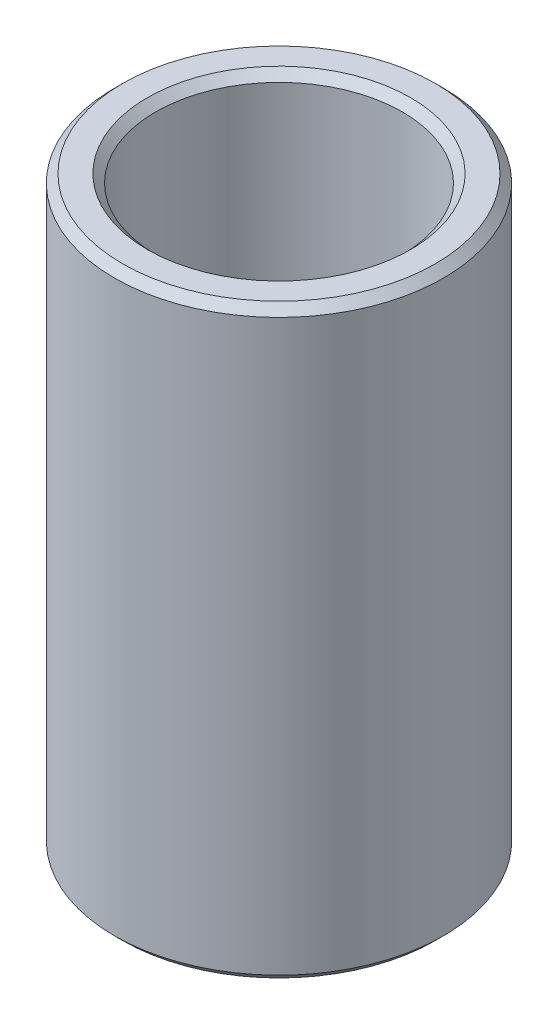
ISO-10303-21;
HEADER;
FILE_DESCRIPTION(('STEP AP214'),'2;1');
FILE_NAME('part.step','',(''),(''),'','','');
FILE_SCHEMA(('AUTOMOTIVE_DESIGN { 1 0 10303 214 1 1 1 1 }'));
ENDSEC;
DATA;
#1=APPLICATION_CONTEXT('core data for automotive mechanical design processes');
#2=APPLICATION_PROTOCOL_DEFINITION('international standard','automotive_design',2000,#1);
#3=PRODUCT_CONTEXT('',#1,'mechanical');
#4=PRODUCT('Part','Part','',(#3));
#5=PRODUCT_RELATED_PRODUCT_CATEGORY('part','',(#4));
#6=PRODUCT_DEFINITION_FORMATION('','',#4);
#7=PRODUCT_DEFINITION_CONTEXT('part definition',#1,'design');
#8=PRODUCT_DEFINITION('design','',#6,#7);
#9=PRODUCT_DEFINITION_SHAPE('','',#8);
#10=(LENGTH_UNIT() NAMED_UNIT(*) SI_UNIT(.MILLI.,.METRE.));
#11=(NAMED_UNIT(*) PLANE_ANGLE_UNIT() SI_UNIT($,.RADIAN.));
#12=(NAMED_UNIT(*) SI_UNIT($,.STERADIAN.) SOLID_ANGLE_UNIT());
#13=UNCERTAINTY_MEASURE_WITH_UNIT(LENGTH_MEASURE(1.E-05),#10,'distance_accuracy_value','');
#14=(GEOMETRIC_REPRESENTATION_CONTEXT(3) GLOBAL_UNCERTAINTY_ASSIGNED_CONTEXT((#13)) GLOBAL_UNIT_ASSIGNED_CONTEXT((#10,
#11,#12)) REPRESENTATION_CONTEXT('',''));
#15=CARTESIAN_POINT('',(0.,0.,0.));
#16=DIRECTION('',(0.,0.,1.));
#17=DIRECTION('',(1.,0.,0.));
#18=AXIS2_PLACEMENT_3D('',#15,#16,#17);
#19=CARTESIAN_POINT('',(0.,14.25,0.));
#20=DIRECTION('',(0.,1.,0.));
#21=DIRECTION('',(0.,0.,1.));
#22=AXIS2_PLACEMENT_3D('',#19,#20,#21);
#23=PLANE('',#22);
#24=CARTESIAN_POINT('',(0.,14.25,0.));
#25=DIRECTION('',(0.,1.,0.));
#26=DIRECTION('',(0.,0.,1.));
#27=AXIS2_PLACEMENT_3D('',#24,#25,#26);
#28=CIRCLE('',#27,3.80000000000001);
#29=CARTESIAN_POINT('',(0.,14.25,3.80000000000001));
#30=VERTEX_POINT('',#29);
#31=EDGE_CURVE('E45',#30,#30,#28,.T.);
#32=ORIENTED_EDGE('',*,*,#31,.T.);
#33=EDGE_LOOP('',(#32));
#34=FACE_BOUND('',#33,.T.);
#35=CARTESIAN_POINT('',(0.,14.25,0.));
#36=DIRECTION('',(0.,1.,0.));
#37=DIRECTION('',(0.,0.,1.));
#38=AXIS2_PLACEMENT_3D('',#35,#36,#37);
#39=CIRCLE('',#38,3.20000000000001);
#40=CARTESIAN_POINT('',(0.,14.25,3.20000000000001));
#41=VERTEX_POINT('',#40);
#42=EDGE_CURVE('E49',#41,#41,#39,.F.);
#43=ORIENTED_EDGE('',*,*,#42,.T.);
#44=EDGE_LOOP('',(#43));
#45=FACE_BOUND('',#44,.T.);
#46=ADVANCED_FACE('F34',(#34,#45),#23,.T.);
#47=CARTESIAN_POINT('',(0.,0.,0.));
#48=DIRECTION('',(0.,1.,0.));
#49=DIRECTION('',(0.,0.,1.));
#50=AXIS2_PLACEMENT_3D('',#47,#48,#49);
#51=PLANE('',#50);
#52=CARTESIAN_POINT('',(0.,0.,0.));
#53=DIRECTION('',(0.,1.,0.));
#54=DIRECTION('',(0.,0.,1.));
#55=AXIS2_PLACEMENT_3D('',#52,#53,#54);
#56=CIRCLE('',#55,3.79999999999999);
#57=CARTESIAN_POINT('',(0.,0.,3.79999999999999));
#58=VERTEX_POINT('',#57);
#59=EDGE_CURVE('E54',#58,#58,#56,.F.);
#60=ORIENTED_EDGE('',*,*,#59,.T.);
#61=EDGE_LOOP('',(#60));
#62=FACE_BOUND('',#61,.T.);
#63=CARTESIAN_POINT('',(0.,0.,0.));
#64=DIRECTION('',(0.,1.,0.));
#65=DIRECTION('',(0.,0.,1.));
#66=AXIS2_PLACEMENT_3D('',#63,#64,#65);
#67=CIRCLE('',#66,3.2);
#68=CARTESIAN_POINT('',(0.,0.,3.2));
#69=VERTEX_POINT('',#68);
#70=EDGE_CURVE('E57',#69,#69,#67,.T.);
#71=ORIENTED_EDGE('',*,*,#70,.T.);
#72=EDGE_LOOP('',(#71));
#73=FACE_BOUND('',#72,.T.);
#74=ADVANCED_FACE('F79',(#62,#73),#51,.F.);
#75=CARTESIAN_POINT('',(0.,14.25,0.));
#76=DIRECTION('',(0.,-1.,0.));
#77=DIRECTION('',(0.,0.,-1.));
#78=AXIS2_PLACEMENT_3D('',#75,#76,#77);
#79=CYLINDRICAL_SURFACE('',#78,4.);
#80=CARTESIAN_POINT('',(0.,0.200000000000007,0.));
#81=DIRECTION('',(0.,1.,0.));
#82=DIRECTION('',(0.,0.,1.));
#83=AXIS2_PLACEMENT_3D('',#80,#81,#82);
#84=CIRCLE('',#83,4.);
#85=CARTESIAN_POINT('',(0.,0.200000000000006,-4.));
#86=VERTEX_POINT('',#85);
#87=EDGE_CURVE('E60',#86,#86,#84,.T.);
#88=CARTESIAN_POINT('',(0.,14.05,0.));
#89=DIRECTION('',(0.,1.,0.));
#90=DIRECTION('',(0.,0.,1.));
#91=AXIS2_PLACEMENT_3D('',#88,#89,#90);
#92=CIRCLE('',#91,4.);
#93=CARTESIAN_POINT('',(0.,14.05,-4.));
#94=VERTEX_POINT('',#93);
#95=EDGE_CURVE('E63',#94,#94,#92,.F.);
#96=CARTESIAN_POINT('',(0.,0.200000000000006,-4.));
#97=CARTESIAN_POINT('',(0.,0.344270833333339,-4.));
#98=CARTESIAN_POINT('',(0.,0.488541666666673,-4.));
#99=CARTESIAN_POINT('',(0.,0.77708333333334,-4.));
#100=CARTESIAN_POINT('',(0.,0.921354166666673,-4.));
#101=CARTESIAN_POINT('',(0.,1.20989583333334,-4.));
#102=CARTESIAN_POINT('',(0.,1.35416666666667,-4.));
#103=CARTESIAN_POINT('',(0.,1.64270833333334,-4.));
#104=CARTESIAN_POINT('',(0.,1.78697916666667,-4.));
#105=CARTESIAN_POINT('',(0.,2.07552083333334,-4.));
#106=CARTESIAN_POINT('',(0.,2.21979166666667,-4.));
#107=CARTESIAN_POINT('',(0.,2.50833333333334,-4.));
#108=CARTESIAN_POINT('',(0.,2.65260416666667,-4.));
#109=CARTESIAN_POINT('',(0.,2.94114583333334,-4.));
#110=CARTESIAN_POINT('',(0.,3.08541666666667,-4.));
#111=CARTESIAN_POINT('',(0.,3.37395833333334,-4.));
#112=CARTESIAN_POINT('',(0.,3.51822916666667,-4.));
#113=CARTESIAN_POINT('',(0.,3.80677083333334,-4.));
#114=CARTESIAN_POINT('',(0.,3.95104166666667,-4.));
#115=CARTESIAN_POINT('',(0.,4.23958333333334,-4.));
#116=CARTESIAN_POINT('',(0.,4.38385416666667,-4.));
#117=CARTESIAN_POINT('',(0.,4.67239583333334,-4.));
#118=CARTESIAN_POINT('',(0.,4.81666666666667,-4.));
#119=CARTESIAN_POINT('',(0.,5.10520833333334,-4.));
#120=CARTESIAN_POINT('',(0.,5.24947916666667,-4.));
#121=CARTESIAN_POINT('',(0.,5.53802083333334,-4.));
#122=CARTESIAN_POINT('',(0.,5.68229166666667,-4.));
#123=CARTESIAN_POINT('',(0.,5.97083333333334,-4.));
#124=CARTESIAN_POINT('',(0.,6.11510416666667,-4.));
#125=CARTESIAN_POINT('',(0.,6.40364583333334,-4.));
#126=CARTESIAN_POINT('',(0.,6.54791666666667,-4.));
#127=CARTESIAN_POINT('',(0.,6.83645833333334,-4.));
#128=CARTESIAN_POINT('',(0.,6.98072916666667,-4.));
#129=CARTESIAN_POINT('',(0.,7.26927083333334,-4.));
#130=CARTESIAN_POINT('',(0.,7.41354166666667,-4.));
#131=CARTESIAN_POINT('',(0.,7.70208333333334,-4.));
#132=CARTESIAN_POINT('',(0.,7.84635416666667,-4.));
#133=CARTESIAN_POINT('',(0.,8.13489583333334,-4.));
#134=CARTESIAN_POINT('',(0.,8.27916666666668,-4.));
#135=CARTESIAN_POINT('',(0.,8.56770833333334,-4.));
#136=CARTESIAN_POINT('',(0.,8.71197916666667,-4.));
#137=CARTESIAN_POINT('',(0.,9.00052083333334,-4.));
#138=CARTESIAN_POINT('',(0.,9.14479166666667,-4.));
#139=CARTESIAN_POINT('',(0.,9.43333333333334,-4.));
#140=CARTESIAN_POINT('',(0.,9.57760416666668,-4.));
#141=CARTESIAN_POINT('',(0.,9.86614583333334,-4.));
#142=CARTESIAN_POINT('',(0.,10.0104166666667,-4.));
#143=CARTESIAN_POINT('',(0.,10.2989583333333,-4.));
#144=CARTESIAN_POINT('',(0.,10.4432291666667,-4.));
#145=CARTESIAN_POINT('',(0.,10.7317708333333,-4.));
#146=CARTESIAN_POINT('',(0.,10.8760416666667,-4.));
#147=CARTESIAN_POINT('',(0.,11.1645833333333,-4.));
#148=CARTESIAN_POINT('',(0.,11.3088541666667,-4.));
#149=CARTESIAN_POINT('',(0.,11.5973958333333,-4.));
#150=CARTESIAN_POINT('',(0.,11.7416666666667,-4.));
#151=CARTESIAN_POINT('',(0.,12.0302083333333,-4.));
#152=CARTESIAN_POINT('',(0.,12.1744791666667,-4.));
#153=CARTESIAN_POINT('',(0.,12.4630208333333,-4.));
#154=CARTESIAN_POINT('',(0.,12.6072916666667,-4.));
#155=CARTESIAN_POINT('',(0.,12.8958333333333,-4.));
#156=CARTESIAN_POINT('',(0.,13.0401041666667,-4.));
#157=CARTESIAN_POINT('',(0.,13.3286458333333,-4.));
#158=CARTESIAN_POINT('',(0.,13.4729166666667,-4.));
#159=CARTESIAN_POINT('',(0.,13.7614583333333,-4.));
#160=CARTESIAN_POINT('',(0.,13.9057291666667,-4.));
#161=CARTESIAN_POINT('',(0.,14.05,-4.));
#162=B_SPLINE_CURVE_WITH_KNOTS('',3,(#96,#97,#98,#99,#100,#101,#102,#103,#104,#105,#106,#107,
#108,#109,#110,#111,#112,#113,#114,#115,#116,#117,#118,#119,#120,#121,#122,#123,#124,#125,#126,
#127,#128,#129,#130,#131,#132,#133,#134,#135,#136,#137,#138,#139,#140,#141,#142,#143,#144,#145,
#146,#147,#148,#149,#150,#151,#152,#153,#154,#155,#156,#157,#158,#159,#160,#161),.UNSPECIFIED.,
.F.,.F.,(4,2,2,2,2,2,2,2,2,2,2,2,2,2,2,2,2,2,2,2,2,2,2,2,2,2,2,2,2,2,2,2,4),(0.,
0.432812500000001,0.865625,1.2984375,1.73125,2.1640625,2.596875,3.0296875,3.4625,3.8953125,
4.328125,4.7609375,5.19375,5.6265625,6.059375,6.4921875,6.925,7.3578125,7.790625,8.2234375,
8.65625,9.0890625,9.521875,9.9546875,10.3875,10.8203125,11.253125,11.6859375,12.11875,
12.5515625,12.984375,13.4171875,13.85),.UNSPECIFIED.);
#163=EDGE_CURVE('BSEAM67',#86,#94,#162,.T.);
#164=ORIENTED_EDGE('',*,*,#87,.T.);
#165=ORIENTED_EDGE('',*,*,#95,.T.);
#166=ORIENTED_EDGE('',*,*,#163,.T.);
#167=ORIENTED_EDGE('',*,*,#163,.F.);
#168=EDGE_LOOP('',(#164,#166,#165,#167));
#169=FACE_BOUND('',#168,.T.);
#170=ADVANCED_FACE('F67',(#169),#79,.T.);
#171=CARTESIAN_POINT('',(0.,14.25,0.));
#172=DIRECTION('',(0.,-1.,0.));
#173=DIRECTION('',(0.,0.,-1.));
#174=AXIS2_PLACEMENT_3D('',#171,#172,#173);
#175=CYLINDRICAL_SURFACE('',#174,3.);
#176=CARTESIAN_POINT('',(0.,0.199999999999997,0.));
#177=DIRECTION('',(0.,1.,0.));
#178=DIRECTION('',(0.,0.,1.));
#179=AXIS2_PLACEMENT_3D('',#176,#177,#178);
#180=CIRCLE('',#179,3.);
#181=CARTESIAN_POINT('',(0.,0.199999999999995,-3.));
#182=VERTEX_POINT('',#181);
#183=EDGE_CURVE('E10',#182,#182,#180,.F.);
#184=CARTESIAN_POINT('',(0.,14.05,0.));
#185=DIRECTION('',(0.,1.,0.));
#186=DIRECTION('',(0.,0.,1.));
#187=AXIS2_PLACEMENT_3D('',#184,#185,#186);
#188=CIRCLE('',#187,3.);
#189=CARTESIAN_POINT('',(0.,14.05,-3.));
#190=VERTEX_POINT('',#189);
#191=EDGE_CURVE('E41',#190,#190,#188,.T.);
#192=CARTESIAN_POINT('',(0.,0.199999999999995,-3.));
#193=CARTESIAN_POINT('',(0.,0.344270833333328,-3.));
#194=CARTESIAN_POINT('',(0.,0.488541666666661,-3.));
#195=CARTESIAN_POINT('',(0.,0.777083333333328,-3.));
#196=CARTESIAN_POINT('',(0.,0.921354166666662,-3.));
#197=CARTESIAN_POINT('',(0.,1.20989583333333,-3.));
#198=CARTESIAN_POINT('',(0.,1.35416666666666,-3.));
#199=CARTESIAN_POINT('',(0.,1.64270833333333,-3.));
#200=CARTESIAN_POINT('',(0.,1.78697916666666,-3.));
#201=CARTESIAN_POINT('',(0.,2.07552083333333,-3.));
#202=CARTESIAN_POINT('',(0.,2.21979166666666,-3.));
#203=CARTESIAN_POINT('',(0.,2.50833333333333,-3.));
#204=CARTESIAN_POINT('',(0.,2.65260416666666,-3.));
#205=CARTESIAN_POINT('',(0.,2.94114583333333,-3.));
#206=CARTESIAN_POINT('',(0.,3.08541666666666,-3.));
#207=CARTESIAN_POINT('',(0.,3.37395833333333,-3.));
#208=CARTESIAN_POINT('',(0.,3.51822916666666,-3.));
#209=CARTESIAN_POINT('',(0.,3.80677083333333,-3.));
#210=CARTESIAN_POINT('',(0.,3.95104166666666,-3.));
#211=CARTESIAN_POINT('',(0.,4.23958333333333,-3.));
#212=CARTESIAN_POINT('',(0.,4.38385416666666,-3.));
#213=CARTESIAN_POINT('',(0.,4.67239583333333,-3.));
#214=CARTESIAN_POINT('',(0.,4.81666666666666,-3.));
#215=CARTESIAN_POINT('',(0.,5.10520833333333,-3.));
#216=CARTESIAN_POINT('',(0.,5.24947916666666,-3.));
#217=CARTESIAN_POINT('',(0.,5.53802083333333,-3.));
#218=CARTESIAN_POINT('',(0.,5.68229166666666,-3.));
#219=CARTESIAN_POINT('',(0.,5.97083333333333,-3.));
#220=CARTESIAN_POINT('',(0.,6.11510416666666,-3.));
#221=CARTESIAN_POINT('',(0.,6.40364583333333,-3.));
#222=CARTESIAN_POINT('',(0.,6.54791666666666,-3.));
#223=CARTESIAN_POINT('',(0.,6.83645833333333,-3.));
#224=CARTESIAN_POINT('',(0.,6.98072916666666,-3.));
#225=CARTESIAN_POINT('',(0.,7.26927083333333,-3.));
#226=CARTESIAN_POINT('',(0.,7.41354166666666,-3.));
#227=CARTESIAN_POINT('',(0.,7.70208333333333,-3.));
#228=CARTESIAN_POINT('',(0.,7.84635416666666,-3.));
#229=CARTESIAN_POINT('',(0.,8.13489583333333,-3.));
#230=CARTESIAN_POINT('',(0.,8.27916666666666,-3.));
#231=CARTESIAN_POINT('',(0.,8.56770833333333,-3.));
#232=CARTESIAN_POINT('',(0.,8.71197916666666,-3.));
#233=CARTESIAN_POINT('',(0.,9.00052083333333,-3.));
#234=CARTESIAN_POINT('',(0.,9.14479166666666,-3.));
#235=CARTESIAN_POINT('',(0.,9.43333333333333,-3.));
#236=CARTESIAN_POINT('',(0.,9.57760416666666,-3.));
#237=CARTESIAN_POINT('',(0.,9.86614583333333,-3.));
#238=CARTESIAN_POINT('',(0.,10.0104166666667,-3.));
#239=CARTESIAN_POINT('',(0.,10.2989583333333,-3.));
#240=CARTESIAN_POINT('',(0.,10.4432291666667,-3.));
#241=CARTESIAN_POINT('',(0.,10.7317708333333,-3.));
#242=CARTESIAN_POINT('',(0.,10.8760416666667,-3.));
#243=CARTESIAN_POINT('',(0.,11.1645833333333,-3.));
#244=CARTESIAN_POINT('',(0.,11.3088541666667,-3.));
#245=CARTESIAN_POINT('',(0.,11.5973958333333,-3.));
#246=CARTESIAN_POINT('',(0.,11.7416666666667,-3.));
#247=CARTESIAN_POINT('',(0.,12.0302083333333,-3.));
#248=CARTESIAN_POINT('',(0.,12.1744791666667,-3.));
#249=CARTESIAN_POINT('',(0.,12.4630208333333,-3.));
#250=CARTESIAN_POINT('',(0.,12.6072916666667,-3.));
#251=CARTESIAN_POINT('',(0.,12.8958333333333,-3.));
#252=CARTESIAN_POINT('',(0.,13.0401041666667,-3.));
#253=CARTESIAN_POINT('',(0.,13.3286458333333,-3.));
#254=CARTESIAN_POINT('',(0.,13.4729166666667,-3.));
#255=CARTESIAN_POINT('',(0.,13.7614583333333,-3.));
#256=CARTESIAN_POINT('',(0.,13.9057291666667,-3.));
#257=CARTESIAN_POINT('',(0.,14.05,-3.));
#258=B_SPLINE_CURVE_WITH_KNOTS('',3,(#192,#193,#194,#195,#196,#197,#198,#199,#200,#201,#202,
#203,#204,#205,#206,#207,#208,#209,#210,#211,#212,#213,#214,#215,#216,#217,#218,#219,#220,#221,
#222,#223,#224,#225,#226,#227,#228,#229,#230,#231,#232,#233,#234,#235,#236,#237,#238,#239,#240,
#241,#242,#243,#244,#245,#246,#247,#248,#249,#250,#251,#252,#253,#254,#255,#256,#257),
.UNSPECIFIED.,.F.,.F.,(4,2,2,2,2,2,2,2,2,2,2,2,2,2,2,2,2,2,2,2,2,2,2,2,2,2,2,2,2,2,2,2,4),(0.,
0.432812499999999,0.865625,1.2984375,1.73125,2.1640625,2.596875,3.0296875,3.4625,3.8953125,
4.328125,4.7609375,5.19375,5.6265625,6.059375,6.4921875,6.925,7.3578125,7.790625,8.2234375,
8.65625,9.0890625,9.521875,9.9546875,10.3875,10.8203125,11.253125,11.6859375,12.11875,
12.5515625,12.984375,13.4171875,13.85),.UNSPECIFIED.);
#259=EDGE_CURVE('BSEAM95',#182,#190,#258,.T.);
#260=ORIENTED_EDGE('',*,*,#183,.T.);
#261=ORIENTED_EDGE('',*,*,#191,.T.);
#262=ORIENTED_EDGE('',*,*,#259,.T.);
#263=ORIENTED_EDGE('',*,*,#259,.F.);
#264=EDGE_LOOP('',(#260,#262,#261,#263));
#265=FACE_BOUND('',#264,.T.);
#266=ADVANCED_FACE('F95',(#265),#175,.F.);
#267=CARTESIAN_POINT('',(0.,0.200000000000007,0.));
#268=DIRECTION('',(0.,1.,0.));
#269=DIRECTION('',(0.,0.,1.));
#270=AXIS2_PLACEMENT_3D('',#267,#268,#269);
#271=CONICAL_SURFACE('',#270,4.,0.785398163397455);
#272=ORIENTED_EDGE('',*,*,#59,.F.);
#273=EDGE_LOOP('',(#272));
#274=FACE_BOUND('',#273,.T.);
#275=ORIENTED_EDGE('',*,*,#87,.F.);
#276=EDGE_LOOP('',(#275));
#277=FACE_BOUND('',#276,.T.);
#278=ADVANCED_FACE('F73',(#274,#277),#271,.T.);
#279=CARTESIAN_POINT('',(0.,14.25,0.));
#280=DIRECTION('',(0.,-1.,0.));
#281=DIRECTION('',(0.,0.,-1.));
#282=AXIS2_PLACEMENT_3D('',#279,#280,#281);
#283=CONICAL_SURFACE('',#282,3.80000000000001,0.785398163397446);
#284=ORIENTED_EDGE('',*,*,#95,.F.);
#285=EDGE_LOOP('',(#284));
#286=FACE_BOUND('',#285,.T.);
#287=ORIENTED_EDGE('',*,*,#31,.F.);
#288=EDGE_LOOP('',(#287));
#289=FACE_BOUND('',#288,.T.);
#290=ADVANCED_FACE('F69',(#286,#289),#283,.T.);
#291=CARTESIAN_POINT('',(0.,0.,0.));
#292=DIRECTION('',(0.,-1.,0.));
#293=DIRECTION('',(0.,0.,-1.));
#294=AXIS2_PLACEMENT_3D('',#291,#292,#293);
#295=CONICAL_SURFACE('',#294,3.2,0.785398163397448);
#296=ORIENTED_EDGE('',*,*,#183,.F.);
#297=EDGE_LOOP('',(#296));
#298=FACE_BOUND('',#297,.T.);
#299=ORIENTED_EDGE('',*,*,#70,.F.);
#300=EDGE_LOOP('',(#299));
#301=FACE_BOUND('',#300,.T.);
#302=ADVANCED_FACE('F72',(#298,#301),#295,.F.);
#303=CARTESIAN_POINT('',(0.,14.05,0.));
#304=DIRECTION('',(0.,1.,0.));
#305=DIRECTION('',(0.,0.,1.));
#306=AXIS2_PLACEMENT_3D('',#303,#304,#305);
#307=CONICAL_SURFACE('',#306,3.,0.78539816339744);
#308=ORIENTED_EDGE('',*,*,#42,.F.);
#309=EDGE_LOOP('',(#308));
#310=FACE_BOUND('',#309,.T.);
#311=ORIENTED_EDGE('',*,*,#191,.F.);
#312=EDGE_LOOP('',(#311));
#313=FACE_BOUND('',#312,.T.);
#314=ADVANCED_FACE('F36',(#310,#313),#307,.F.);
#315=CLOSED_SHELL('',(#46,#74,#170,#266,#278,#290,#302,#314));
#316=MANIFOLD_SOLID_BREP('B2',#315);
#317=ADVANCED_BREP_SHAPE_REPRESENTATION('',(#18,#316),#14);
#318=SHAPE_DEFINITION_REPRESENTATION(#9,#317);
ENDSEC;
END-ISO-10303-21;
